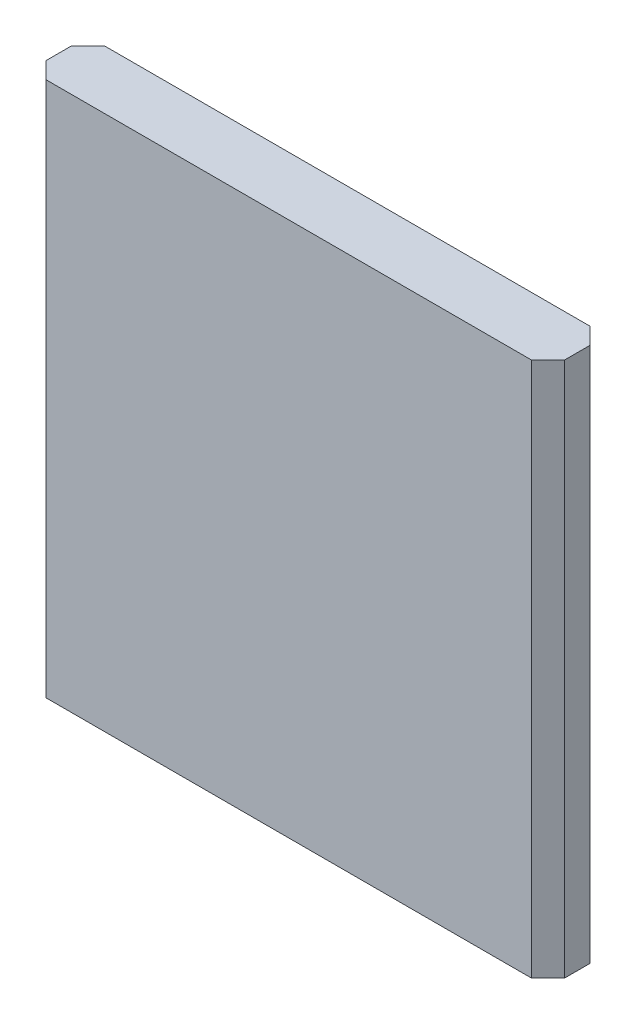
ISO-10303-21;
HEADER;
FILE_DESCRIPTION(('STEP AP214'),'2;1');
FILE_NAME('part.step','',(''),(''),'','','');
FILE_SCHEMA(('AUTOMOTIVE_DESIGN { 1 0 10303 214 1 1 1 1 }'));
ENDSEC;
DATA;
#1=APPLICATION_CONTEXT('core data for automotive mechanical design processes');
#2=APPLICATION_PROTOCOL_DEFINITION('international standard','automotive_design',2000,#1);
#3=PRODUCT_CONTEXT('',#1,'mechanical');
#4=PRODUCT('Part','Part','',(#3));
#5=PRODUCT_RELATED_PRODUCT_CATEGORY('part','',(#4));
#6=PRODUCT_DEFINITION_FORMATION('','',#4);
#7=PRODUCT_DEFINITION_CONTEXT('part definition',#1,'design');
#8=PRODUCT_DEFINITION('design','',#6,#7);
#9=PRODUCT_DEFINITION_SHAPE('','',#8);
#10=(LENGTH_UNIT() NAMED_UNIT(*) SI_UNIT(.MILLI.,.METRE.));
#11=(NAMED_UNIT(*) PLANE_ANGLE_UNIT() SI_UNIT($,.RADIAN.));
#12=(NAMED_UNIT(*) SI_UNIT($,.STERADIAN.) SOLID_ANGLE_UNIT());
#13=UNCERTAINTY_MEASURE_WITH_UNIT(LENGTH_MEASURE(1.E-05),#10,'distance_accuracy_value','');
#14=(GEOMETRIC_REPRESENTATION_CONTEXT(3) GLOBAL_UNCERTAINTY_ASSIGNED_CONTEXT((#13)) GLOBAL_UNIT_ASSIGNED_CONTEXT((#10,
#11,#12)) REPRESENTATION_CONTEXT('',''));
#15=CARTESIAN_POINT('',(0.,0.,0.));
#16=DIRECTION('',(0.,0.,1.));
#17=DIRECTION('',(1.,0.,0.));
#18=AXIS2_PLACEMENT_3D('',#15,#16,#17);
#19=CARTESIAN_POINT('',(-45.,-30.0000000000001,35.));
#20=DIRECTION('',(-1.,0.,0.));
#21=DIRECTION('',(0.,-1.,0.));
#22=AXIS2_PLACEMENT_3D('',#19,#20,#21);
#23=PLANE('',#22);
#24=DIRECTION('',(0.,0.,-1.));
#25=VECTOR('',#24,1.);
#26=CARTESIAN_POINT('',(-45.,-350.,35.));
#27=LINE('',#26,#25);
#28=CARTESIAN_POINT('',(-45.,-350.,25.));
#29=VERTEX_POINT('',#28);
#30=CARTESIAN_POINT('',(-45.,-350.,10.0000000000001));
#31=VERTEX_POINT('',#30);
#32=EDGE_CURVE('E121',#29,#31,#27,.T.);
#33=ORIENTED_EDGE('',*,*,#32,.T.);
#34=DIRECTION('',(0.,1.,0.));
#35=VECTOR('',#34,1.);
#36=CARTESIAN_POINT('',(-45.,-30.0000000000001,10.0000000000001));
#37=LINE('',#36,#35);
#38=CARTESIAN_POINT('',(-45.,-30.0000000000001,10.0000000000001));
#39=VERTEX_POINT('',#38);
#40=EDGE_CURVE('E11',#31,#39,#37,.T.);
#41=ORIENTED_EDGE('',*,*,#40,.T.);
#42=DIRECTION('',(0.,0.,-1.));
#43=VECTOR('',#42,1.);
#44=CARTESIAN_POINT('',(-45.,-30.0000000000001,35.));
#45=LINE('',#44,#43);
#46=CARTESIAN_POINT('',(-45.,-30.0000000000001,25.));
#47=VERTEX_POINT('',#46);
#48=EDGE_CURVE('E126',#47,#39,#45,.T.);
#49=ORIENTED_EDGE('',*,*,#48,.F.);
#50=DIRECTION('',(0.,-1.,0.));
#51=VECTOR('',#50,1.);
#52=CARTESIAN_POINT('',(-45.,-30.0000000000001,25.));
#53=LINE('',#52,#51);
#54=EDGE_CURVE('E41',#47,#29,#53,.T.);
#55=ORIENTED_EDGE('',*,*,#54,.T.);
#56=EDGE_LOOP('',(#33,#41,#49,#55));
#57=FACE_BOUND('',#56,.T.);
#58=ADVANCED_FACE('F33',(#57),#23,.F.);
#59=CARTESIAN_POINT('',(-45.,-30.0000000000001,35.));
#60=DIRECTION('',(0.,-1.,0.));
#61=DIRECTION('',(1.,0.,0.));
#62=AXIS2_PLACEMENT_3D('',#59,#60,#61);
#63=PLANE('',#62);
#64=DIRECTION('',(-1.,0.,0.));
#65=VECTOR('',#64,1.);
#66=CARTESIAN_POINT('',(-45.,-30.0000000000001,0.));
#67=LINE('',#66,#65);
#68=CARTESIAN_POINT('',(-55.0000000000001,-30.0000000000001,0.));
#69=VERTEX_POINT('',#68);
#70=CARTESIAN_POINT('',(-345.,-30.0000000000001,0.));
#71=VERTEX_POINT('',#70);
#72=EDGE_CURVE('E168',#69,#71,#67,.T.);
#73=ORIENTED_EDGE('',*,*,#72,.T.);
#74=DIRECTION('',(-0.707106781186548,0.,0.707106781186547));
#75=VECTOR('',#74,1.);
#76=CARTESIAN_POINT('',(-355.,-30.0000000000001,10.));
#77=LINE('',#76,#75);
#78=CARTESIAN_POINT('',(-355.,-30.0000000000001,10.));
#79=VERTEX_POINT('',#78);
#80=EDGE_CURVE('E143',#71,#79,#77,.T.);
#81=ORIENTED_EDGE('',*,*,#80,.T.);
#82=DIRECTION('',(0.,0.,-1.));
#83=VECTOR('',#82,1.);
#84=CARTESIAN_POINT('',(-355.,-30.0000000000001,35.));
#85=LINE('',#84,#83);
#86=CARTESIAN_POINT('',(-355.,-30.0000000000001,25.));
#87=VERTEX_POINT('',#86);
#88=EDGE_CURVE('E120',#87,#79,#85,.T.);
#89=ORIENTED_EDGE('',*,*,#88,.F.);
#90=DIRECTION('',(-0.707106781186548,0.,-0.707106781186547));
#91=VECTOR('',#90,1.);
#92=CARTESIAN_POINT('',(-345.,-30.0000000000001,35.));
#93=LINE('',#92,#91);
#94=CARTESIAN_POINT('',(-345.,-30.0000000000001,35.));
#95=VERTEX_POINT('',#94);
#96=EDGE_CURVE('E125',#87,#95,#93,.F.);
#97=ORIENTED_EDGE('',*,*,#96,.T.);
#98=DIRECTION('',(-1.,0.,0.));
#99=VECTOR('',#98,1.);
#100=CARTESIAN_POINT('',(-45.,-30.0000000000001,35.));
#101=LINE('',#100,#99);
#102=CARTESIAN_POINT('',(-54.9999999999999,-30.0000000000001,35.));
#103=VERTEX_POINT('',#102);
#104=EDGE_CURVE('E162',#103,#95,#101,.T.);
#105=ORIENTED_EDGE('',*,*,#104,.F.);
#106=DIRECTION('',(-0.707106781186546,0.,0.707106781186549));
#107=VECTOR('',#106,1.);
#108=CARTESIAN_POINT('',(-54.9999999999999,-30.0000000000001,35.));
#109=LINE('',#108,#107);
#110=EDGE_CURVE('E55',#103,#47,#109,.F.);
#111=ORIENTED_EDGE('',*,*,#110,.T.);
#112=ORIENTED_EDGE('',*,*,#48,.T.);
#113=DIRECTION('',(-0.707106781186548,0.,-0.707106781186547));
#114=VECTOR('',#113,1.);
#115=CARTESIAN_POINT('',(-45.,-30.0000000000001,10.0000000000001));
#116=LINE('',#115,#114);
#117=EDGE_CURVE('E48',#39,#69,#116,.T.);
#118=ORIENTED_EDGE('',*,*,#117,.T.);
#119=EDGE_LOOP('',(#73,#81,#89,#97,#105,#111,#112,#118));
#120=FACE_BOUND('',#119,.T.);
#121=ADVANCED_FACE('F164',(#120),#63,.F.);
#122=CARTESIAN_POINT('',(-355.,-30.0000000000001,35.));
#123=DIRECTION('',(1.,0.,0.));
#124=DIRECTION('',(0.,1.,0.));
#125=AXIS2_PLACEMENT_3D('',#122,#123,#124);
#126=PLANE('',#125);
#127=ORIENTED_EDGE('',*,*,#88,.T.);
#128=DIRECTION('',(0.,-1.,0.));
#129=VECTOR('',#128,1.);
#130=CARTESIAN_POINT('',(-355.,-350.,10.));
#131=LINE('',#130,#129);
#132=CARTESIAN_POINT('',(-355.,-350.,10.));
#133=VERTEX_POINT('',#132);
#134=EDGE_CURVE('E119',#79,#133,#131,.T.);
#135=ORIENTED_EDGE('',*,*,#134,.T.);
#136=DIRECTION('',(0.,0.,-1.));
#137=VECTOR('',#136,1.);
#138=CARTESIAN_POINT('',(-355.,-350.,35.));
#139=LINE('',#138,#137);
#140=CARTESIAN_POINT('',(-355.,-350.,25.));
#141=VERTEX_POINT('',#140);
#142=EDGE_CURVE('E102',#141,#133,#139,.T.);
#143=ORIENTED_EDGE('',*,*,#142,.F.);
#144=DIRECTION('',(0.,1.,0.));
#145=VECTOR('',#144,1.);
#146=CARTESIAN_POINT('',(-355.,-30.0000000000001,25.));
#147=LINE('',#146,#145);
#148=EDGE_CURVE('E116',#141,#87,#147,.T.);
#149=ORIENTED_EDGE('',*,*,#148,.T.);
#150=EDGE_LOOP('',(#127,#135,#143,#149));
#151=FACE_BOUND('',#150,.T.);
#152=ADVANCED_FACE('F115',(#151),#126,.F.);
#153=CARTESIAN_POINT('',(-45.,-350.,35.));
#154=DIRECTION('',(0.,1.,0.));
#155=DIRECTION('',(-1.,0.,0.));
#156=AXIS2_PLACEMENT_3D('',#153,#154,#155);
#157=PLANE('',#156);
#158=ORIENTED_EDGE('',*,*,#142,.T.);
#159=DIRECTION('',(0.707106781186548,0.,-0.707106781186547));
#160=VECTOR('',#159,1.);
#161=CARTESIAN_POINT('',(-355.,-350.,10.));
#162=LINE('',#161,#160);
#163=CARTESIAN_POINT('',(-345.,-350.,0.));
#164=VERTEX_POINT('',#163);
#165=EDGE_CURVE('E109',#133,#164,#162,.T.);
#166=ORIENTED_EDGE('',*,*,#165,.T.);
#167=DIRECTION('',(1.,0.,0.));
#168=VECTOR('',#167,1.);
#169=CARTESIAN_POINT('',(-45.,-350.,0.));
#170=LINE('',#169,#168);
#171=CARTESIAN_POINT('',(-55.,-350.,0.));
#172=VERTEX_POINT('',#171);
#173=EDGE_CURVE('E165',#164,#172,#170,.T.);
#174=ORIENTED_EDGE('',*,*,#173,.T.);
#175=DIRECTION('',(0.707106781186548,0.,0.707106781186547));
#176=VECTOR('',#175,1.);
#177=CARTESIAN_POINT('',(-44.9999999999999,-350.,10.0000000000001));
#178=LINE('',#177,#176);
#179=EDGE_CURVE('E110',#172,#31,#178,.T.);
#180=ORIENTED_EDGE('',*,*,#179,.T.);
#181=ORIENTED_EDGE('',*,*,#32,.F.);
#182=DIRECTION('',(0.707106781186546,0.,-0.707106781186549));
#183=VECTOR('',#182,1.);
#184=CARTESIAN_POINT('',(-54.9999999999999,-350.,35.));
#185=LINE('',#184,#183);
#186=CARTESIAN_POINT('',(-54.9999999999999,-350.,35.));
#187=VERTEX_POINT('',#186);
#188=EDGE_CURVE('E128',#29,#187,#185,.F.);
#189=ORIENTED_EDGE('',*,*,#188,.T.);
#190=DIRECTION('',(1.,0.,0.));
#191=VECTOR('',#190,1.);
#192=CARTESIAN_POINT('',(-45.,-350.,35.));
#193=LINE('',#192,#191);
#194=CARTESIAN_POINT('',(-345.,-350.,35.));
#195=VERTEX_POINT('',#194);
#196=EDGE_CURVE('E104',#195,#187,#193,.T.);
#197=ORIENTED_EDGE('',*,*,#196,.F.);
#198=DIRECTION('',(0.707106781186548,0.,0.707106781186547));
#199=VECTOR('',#198,1.);
#200=CARTESIAN_POINT('',(-345.,-350.,35.));
#201=LINE('',#200,#199);
#202=EDGE_CURVE('E99',#195,#141,#201,.F.);
#203=ORIENTED_EDGE('',*,*,#202,.T.);
#204=EDGE_LOOP('',(#158,#166,#174,#180,#181,#189,#197,#203));
#205=FACE_BOUND('',#204,.T.);
#206=ADVANCED_FACE('F101',(#205),#157,.F.);
#207=CARTESIAN_POINT('',(0.,0.,35.));
#208=DIRECTION('',(0.,0.,-1.));
#209=DIRECTION('',(-1.,0.,0.));
#210=AXIS2_PLACEMENT_3D('',#207,#208,#209);
#211=PLANE('',#210);
#212=ORIENTED_EDGE('',*,*,#104,.T.);
#213=DIRECTION('',(0.,-1.,0.));
#214=VECTOR('',#213,1.);
#215=CARTESIAN_POINT('',(-345.,0.,35.));
#216=LINE('',#215,#214);
#217=EDGE_CURVE('E148',#95,#195,#216,.T.);
#218=ORIENTED_EDGE('',*,*,#217,.T.);
#219=ORIENTED_EDGE('',*,*,#196,.T.);
#220=DIRECTION('',(0.,1.,0.));
#221=VECTOR('',#220,1.);
#222=CARTESIAN_POINT('',(-55.,0.,35.));
#223=LINE('',#222,#221);
#224=EDGE_CURVE('E145',#187,#103,#223,.T.);
#225=ORIENTED_EDGE('',*,*,#224,.T.);
#226=EDGE_LOOP('',(#212,#218,#219,#225));
#227=FACE_BOUND('',#226,.T.);
#228=ADVANCED_FACE('F161',(#227),#211,.F.);
#229=CARTESIAN_POINT('',(0.,0.,0.));
#230=DIRECTION('',(0.,0.,-1.));
#231=DIRECTION('',(-1.,0.,0.));
#232=AXIS2_PLACEMENT_3D('',#229,#230,#231);
#233=PLANE('',#232);
#234=ORIENTED_EDGE('',*,*,#173,.F.);
#235=DIRECTION('',(0.,1.,0.));
#236=VECTOR('',#235,1.);
#237=CARTESIAN_POINT('',(-345.,-30.0000000000001,0.));
#238=LINE('',#237,#236);
#239=EDGE_CURVE('E138',#164,#71,#238,.T.);
#240=ORIENTED_EDGE('',*,*,#239,.T.);
#241=ORIENTED_EDGE('',*,*,#72,.F.);
#242=DIRECTION('',(0.,-1.,0.));
#243=VECTOR('',#242,1.);
#244=CARTESIAN_POINT('',(-55.,-350.,0.));
#245=LINE('',#244,#243);
#246=EDGE_CURVE('E136',#69,#172,#245,.T.);
#247=ORIENTED_EDGE('',*,*,#246,.T.);
#248=EDGE_LOOP('',(#234,#240,#241,#247));
#249=FACE_BOUND('',#248,.T.);
#250=ADVANCED_FACE('F177',(#249),#233,.T.);
#251=CARTESIAN_POINT('',(-355.,-30.0000000000001,10.));
#252=DIRECTION('',(-0.707106781186547,0.,-0.707106781186548));
#253=DIRECTION('',(0.,1.,0.));
#254=AXIS2_PLACEMENT_3D('',#251,#252,#253);
#255=PLANE('',#254);
#256=ORIENTED_EDGE('',*,*,#80,.F.);
#257=ORIENTED_EDGE('',*,*,#239,.F.);
#258=ORIENTED_EDGE('',*,*,#165,.F.);
#259=ORIENTED_EDGE('',*,*,#134,.F.);
#260=EDGE_LOOP('',(#256,#257,#258,#259));
#261=FACE_BOUND('',#260,.T.);
#262=ADVANCED_FACE('F173',(#261),#255,.T.);
#263=CARTESIAN_POINT('',(-345.,0.,35.));
#264=DIRECTION('',(0.707106781186547,0.,-0.707106781186548));
#265=DIRECTION('',(0.,-1.,0.));
#266=AXIS2_PLACEMENT_3D('',#263,#264,#265);
#267=PLANE('',#266);
#268=ORIENTED_EDGE('',*,*,#96,.F.);
#269=ORIENTED_EDGE('',*,*,#148,.F.);
#270=ORIENTED_EDGE('',*,*,#202,.F.);
#271=ORIENTED_EDGE('',*,*,#217,.F.);
#272=EDGE_LOOP('',(#268,#269,#270,#271));
#273=FACE_BOUND('',#272,.T.);
#274=ADVANCED_FACE('F124',(#273),#267,.F.);
#275=CARTESIAN_POINT('',(-45.,-30.0000000000001,10.0000000000001));
#276=DIRECTION('',(0.707106781186547,0.,-0.707106781186548));
#277=DIRECTION('',(0.,-1.,0.));
#278=AXIS2_PLACEMENT_3D('',#275,#276,#277);
#279=PLANE('',#278);
#280=ORIENTED_EDGE('',*,*,#179,.F.);
#281=ORIENTED_EDGE('',*,*,#246,.F.);
#282=ORIENTED_EDGE('',*,*,#117,.F.);
#283=ORIENTED_EDGE('',*,*,#40,.F.);
#284=EDGE_LOOP('',(#280,#281,#282,#283));
#285=FACE_BOUND('',#284,.T.);
#286=ADVANCED_FACE('F179',(#285),#279,.T.);
#287=CARTESIAN_POINT('',(-55.,0.,35.));
#288=DIRECTION('',(-0.707106781186549,0.,-0.707106781186546));
#289=DIRECTION('',(0.,1.,0.));
#290=AXIS2_PLACEMENT_3D('',#287,#288,#289);
#291=PLANE('',#290);
#292=ORIENTED_EDGE('',*,*,#188,.F.);
#293=ORIENTED_EDGE('',*,*,#54,.F.);
#294=ORIENTED_EDGE('',*,*,#110,.F.);
#295=ORIENTED_EDGE('',*,*,#224,.F.);
#296=EDGE_LOOP('',(#292,#293,#294,#295));
#297=FACE_BOUND('',#296,.T.);
#298=ADVANCED_FACE('F35',(#297),#291,.F.);
#299=CLOSED_SHELL('',(#58,#121,#152,#206,#228,#250,#262,#274,#286,#298));
#300=MANIFOLD_SOLID_BREP('B2',#299);
#301=ADVANCED_BREP_SHAPE_REPRESENTATION('',(#18,#300),#14);
#302=SHAPE_DEFINITION_REPRESENTATION(#9,#301);
ENDSEC;
END-ISO-10303-21;
